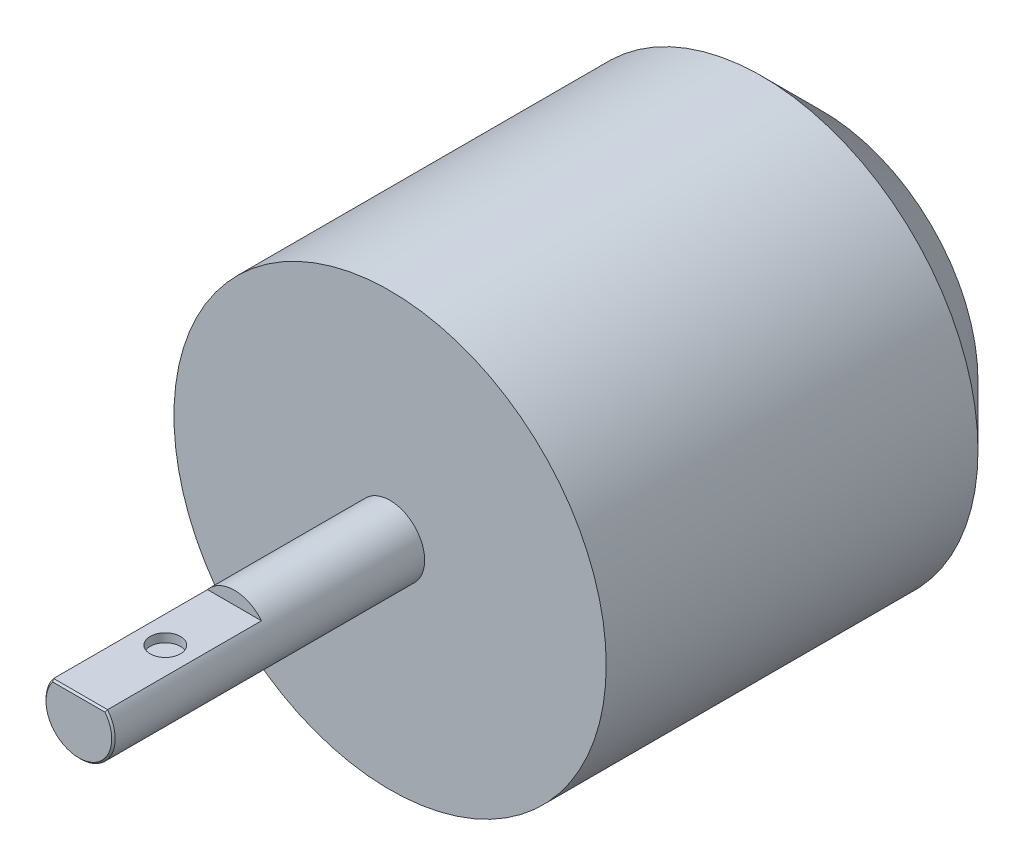
ISO-10303-21;
HEADER;
FILE_DESCRIPTION(('STEP AP214'),'2;1');
FILE_NAME('part.step','',(''),(''),'','','');
FILE_SCHEMA(('AUTOMOTIVE_DESIGN { 1 0 10303 214 1 1 1 1 }'));
ENDSEC;
DATA;
#1=APPLICATION_CONTEXT('core data for automotive mechanical design processes');
#2=APPLICATION_PROTOCOL_DEFINITION('international standard','automotive_design',2000,#1);
#3=PRODUCT_CONTEXT('',#1,'mechanical');
#4=PRODUCT('Part','Part','',(#3));
#5=PRODUCT_RELATED_PRODUCT_CATEGORY('part','',(#4));
#6=PRODUCT_DEFINITION_FORMATION('','',#4);
#7=PRODUCT_DEFINITION_CONTEXT('part definition',#1,'design');
#8=PRODUCT_DEFINITION('design','',#6,#7);
#9=PRODUCT_DEFINITION_SHAPE('','',#8);
#10=(LENGTH_UNIT() NAMED_UNIT(*) SI_UNIT(.MILLI.,.METRE.));
#11=(NAMED_UNIT(*) PLANE_ANGLE_UNIT() SI_UNIT($,.RADIAN.));
#12=(NAMED_UNIT(*) SI_UNIT($,.STERADIAN.) SOLID_ANGLE_UNIT());
#13=UNCERTAINTY_MEASURE_WITH_UNIT(LENGTH_MEASURE(1.E-05),#10,'distance_accuracy_value','');
#14=(GEOMETRIC_REPRESENTATION_CONTEXT(3) GLOBAL_UNCERTAINTY_ASSIGNED_CONTEXT((#13)) GLOBAL_UNIT_ASSIGNED_CONTEXT((#10,
#11,#12)) REPRESENTATION_CONTEXT('',''));
#15=CARTESIAN_POINT('',(0.,0.,0.));
#16=DIRECTION('',(0.,0.,1.));
#17=DIRECTION('',(1.,0.,0.));
#18=AXIS2_PLACEMENT_3D('',#15,#16,#17);
#19=CARTESIAN_POINT('',(0.,0.,50.));
#20=DIRECTION('',(0.,0.,-1.));
#21=DIRECTION('',(-1.,0.,0.));
#22=AXIS2_PLACEMENT_3D('',#19,#20,#21);
#23=CYLINDRICAL_SURFACE('',#22,25.);
#24=CARTESIAN_POINT('',(0.,0.,7.));
#25=DIRECTION('',(0.,0.,1.));
#26=DIRECTION('',(1.,0.,0.));
#27=AXIS2_PLACEMENT_3D('',#24,#25,#26);
#28=CIRCLE('',#27,25.);
#29=CARTESIAN_POINT('',(25.,0.,7.));
#30=VERTEX_POINT('',#29);
#31=EDGE_CURVE('E123',#30,#30,#28,.T.);
#32=ORIENTED_EDGE('',*,*,#31,.T.);
#33=EDGE_LOOP('',(#32));
#34=FACE_BOUND('',#33,.T.);
#35=CARTESIAN_POINT('',(0.,0.,50.));
#36=DIRECTION('',(0.,0.,1.));
#37=DIRECTION('',(1.,0.,0.));
#38=AXIS2_PLACEMENT_3D('',#35,#36,#37);
#39=CIRCLE('',#38,25.);
#40=CARTESIAN_POINT('',(25.,0.,50.));
#41=VERTEX_POINT('',#40);
#42=EDGE_CURVE('E117',#41,#41,#39,.T.);
#43=ORIENTED_EDGE('',*,*,#42,.F.);
#44=EDGE_LOOP('',(#43));
#45=FACE_BOUND('',#44,.T.);
#46=ADVANCED_FACE('F46',(#34,#45),#23,.T.);
#47=CARTESIAN_POINT('',(0.,0.,50.));
#48=DIRECTION('',(0.,0.,1.));
#49=DIRECTION('',(1.,0.,0.));
#50=AXIS2_PLACEMENT_3D('',#47,#48,#49);
#51=PLANE('',#50);
#52=CARTESIAN_POINT('',(0.,0.,50.));
#53=DIRECTION('',(0.,0.,1.));
#54=DIRECTION('',(1.,0.,0.));
#55=AXIS2_PLACEMENT_3D('',#52,#53,#54);
#56=CIRCLE('',#55,4.);
#57=CARTESIAN_POINT('',(4.,0.,50.));
#58=VERTEX_POINT('',#57);
#59=EDGE_CURVE('E110',#58,#58,#56,.T.);
#60=ORIENTED_EDGE('',*,*,#59,.F.);
#61=EDGE_LOOP('',(#60));
#62=FACE_BOUND('',#61,.T.);
#63=ORIENTED_EDGE('',*,*,#42,.T.);
#64=EDGE_LOOP('',(#63));
#65=FACE_BOUND('',#64,.T.);
#66=ADVANCED_FACE('F150',(#62,#65),#51,.T.);
#67=CARTESIAN_POINT('',(0.,0.,0.));
#68=DIRECTION('',(0.,0.,1.));
#69=DIRECTION('',(1.,0.,0.));
#70=AXIS2_PLACEMENT_3D('',#67,#68,#69);
#71=PLANE('',#70);
#72=CARTESIAN_POINT('',(0.,0.,0.));
#73=DIRECTION('',(0.,0.,-1.));
#74=DIRECTION('',(-1.,0.,0.));
#75=AXIS2_PLACEMENT_3D('',#72,#73,#74);
#76=CIRCLE('',#75,10.);
#77=CARTESIAN_POINT('',(-10.,0.,0.));
#78=VERTEX_POINT('',#77);
#79=EDGE_CURVE('E114',#78,#78,#76,.T.);
#80=ORIENTED_EDGE('',*,*,#79,.F.);
#81=EDGE_LOOP('',(#80));
#82=FACE_BOUND('',#81,.T.);
#83=CARTESIAN_POINT('',(0.,0.,0.));
#84=DIRECTION('',(0.,0.,1.));
#85=DIRECTION('',(1.,0.,0.));
#86=AXIS2_PLACEMENT_3D('',#83,#84,#85);
#87=CIRCLE('',#86,18.);
#88=CARTESIAN_POINT('',(18.,0.,0.));
#89=VERTEX_POINT('',#88);
#90=EDGE_CURVE('E120',#89,#89,#87,.F.);
#91=ORIENTED_EDGE('',*,*,#90,.T.);
#92=EDGE_LOOP('',(#91));
#93=FACE_BOUND('',#92,.T.);
#94=ADVANCED_FACE('F146',(#82,#93),#71,.F.);
#95=CARTESIAN_POINT('',(0.,0.,7.));
#96=DIRECTION('',(0.,0.,1.));
#97=DIRECTION('',(1.,0.,0.));
#98=AXIS2_PLACEMENT_3D('',#95,#96,#97);
#99=CONICAL_SURFACE('',#98,25.,0.78539816339745);
#100=CARTESIAN_POINT('',(18.,0.,0.));
#101=CARTESIAN_POINT('',(18.0729166666666,0.,0.0729166666666659));
#102=CARTESIAN_POINT('',(18.1458333333333,0.,0.145833333333333));
#103=CARTESIAN_POINT('',(18.2916666666666,0.,0.291666666666666));
#104=CARTESIAN_POINT('',(18.3645833333333,0.,0.364583333333333));
#105=CARTESIAN_POINT('',(18.5104166666666,0.,0.510416666666666));
#106=CARTESIAN_POINT('',(18.5833333333333,0.,0.583333333333333));
#107=CARTESIAN_POINT('',(18.7291666666666,0.,0.729166666666666));
#108=CARTESIAN_POINT('',(18.8020833333333,0.,0.802083333333332));
#109=CARTESIAN_POINT('',(18.9479166666666,0.,0.947916666666666));
#110=CARTESIAN_POINT('',(19.0208333333333,0.,1.02083333333333));
#111=CARTESIAN_POINT('',(19.1666666666666,0.,1.16666666666667));
#112=CARTESIAN_POINT('',(19.2395833333333,0.,1.23958333333333));
#113=CARTESIAN_POINT('',(19.3854166666666,0.,1.38541666666667));
#114=CARTESIAN_POINT('',(19.4583333333333,0.,1.45833333333333));
#115=CARTESIAN_POINT('',(19.6041666666666,0.,1.60416666666667));
#116=CARTESIAN_POINT('',(19.6770833333333,0.,1.67708333333333));
#117=CARTESIAN_POINT('',(19.8229166666667,0.,1.82291666666667));
#118=CARTESIAN_POINT('',(19.8958333333333,0.,1.89583333333333));
#119=CARTESIAN_POINT('',(20.0416666666667,0.,2.04166666666667));
#120=CARTESIAN_POINT('',(20.1145833333333,0.,2.11458333333333));
#121=CARTESIAN_POINT('',(20.2604166666667,0.,2.26041666666667));
#122=CARTESIAN_POINT('',(20.3333333333333,0.,2.33333333333333));
#123=CARTESIAN_POINT('',(20.4791666666667,0.,2.47916666666667));
#124=CARTESIAN_POINT('',(20.5520833333333,0.,2.55208333333333));
#125=CARTESIAN_POINT('',(20.6979166666667,0.,2.69791666666667));
#126=CARTESIAN_POINT('',(20.7708333333333,0.,2.77083333333333));
#127=CARTESIAN_POINT('',(20.9166666666667,0.,2.91666666666667));
#128=CARTESIAN_POINT('',(20.9895833333333,0.,2.98958333333333));
#129=CARTESIAN_POINT('',(21.1354166666667,0.,3.13541666666667));
#130=CARTESIAN_POINT('',(21.2083333333333,0.,3.20833333333333));
#131=CARTESIAN_POINT('',(21.3541666666667,0.,3.35416666666667));
#132=CARTESIAN_POINT('',(21.4270833333333,0.,3.42708333333333));
#133=CARTESIAN_POINT('',(21.5729166666667,0.,3.57291666666667));
#134=CARTESIAN_POINT('',(21.6458333333333,0.,3.64583333333333));
#135=CARTESIAN_POINT('',(21.7916666666667,0.,3.79166666666667));
#136=CARTESIAN_POINT('',(21.8645833333333,0.,3.86458333333333));
#137=CARTESIAN_POINT('',(22.0104166666667,0.,4.01041666666667));
#138=CARTESIAN_POINT('',(22.0833333333333,0.,4.08333333333333));
#139=CARTESIAN_POINT('',(22.2291666666667,0.,4.22916666666667));
#140=CARTESIAN_POINT('',(22.3020833333333,0.,4.30208333333333));
#141=CARTESIAN_POINT('',(22.4479166666667,0.,4.44791666666667));
#142=CARTESIAN_POINT('',(22.5208333333333,0.,4.52083333333333));
#143=CARTESIAN_POINT('',(22.6666666666667,0.,4.66666666666667));
#144=CARTESIAN_POINT('',(22.7395833333333,0.,4.73958333333333));
#145=CARTESIAN_POINT('',(22.8854166666667,0.,4.88541666666667));
#146=CARTESIAN_POINT('',(22.9583333333333,0.,4.95833333333333));
#147=CARTESIAN_POINT('',(23.1041666666667,0.,5.10416666666667));
#148=CARTESIAN_POINT('',(23.1770833333333,0.,5.17708333333333));
#149=CARTESIAN_POINT('',(23.3229166666667,0.,5.32291666666667));
#150=CARTESIAN_POINT('',(23.3958333333333,0.,5.39583333333333));
#151=CARTESIAN_POINT('',(23.5416666666667,0.,5.54166666666667));
#152=CARTESIAN_POINT('',(23.6145833333333,0.,5.61458333333333));
#153=CARTESIAN_POINT('',(23.7604166666667,0.,5.76041666666667));
#154=CARTESIAN_POINT('',(23.8333333333333,0.,5.83333333333333));
#155=CARTESIAN_POINT('',(23.9791666666667,0.,5.97916666666667));
#156=CARTESIAN_POINT('',(24.0520833333333,0.,6.05208333333333));
#157=CARTESIAN_POINT('',(24.1979166666667,0.,6.19791666666667));
#158=CARTESIAN_POINT('',(24.2708333333333,0.,6.27083333333333));
#159=CARTESIAN_POINT('',(24.4166666666667,0.,6.41666666666667));
#160=CARTESIAN_POINT('',(24.4895833333333,0.,6.48958333333333));
#161=CARTESIAN_POINT('',(24.6354166666667,0.,6.63541666666667));
#162=CARTESIAN_POINT('',(24.7083333333333,0.,6.70833333333333));
#163=CARTESIAN_POINT('',(24.8541666666667,0.,6.85416666666667));
#164=CARTESIAN_POINT('',(24.9270833333333,0.,6.92708333333333));
#165=CARTESIAN_POINT('',(25.,0.,7.));
#166=B_SPLINE_CURVE_WITH_KNOTS('',3,(#100,#101,#102,#103,#104,#105,#106,#107,#108,#109,#110,
#111,#112,#113,#114,#115,#116,#117,#118,#119,#120,#121,#122,#123,#124,#125,#126,#127,#128,#129,
#130,#131,#132,#133,#134,#135,#136,#137,#138,#139,#140,#141,#142,#143,#144,#145,#146,#147,#148,
#149,#150,#151,#152,#153,#154,#155,#156,#157,#158,#159,#160,#161,#162,#163,#164,#165),
.UNSPECIFIED.,.F.,.F.,(4,2,2,2,2,2,2,2,2,2,2,2,2,2,2,2,2,2,2,2,2,2,2,2,2,2,2,2,2,2,2,2,4),(0.,
0.309359216769115,0.61871843353823,0.928077650307344,1.23743686707646,1.54679608384557,
1.85615530061469,2.16551451738381,2.47487373415292,2.78423295092203,3.09359216769115,
3.40295138446026,3.71231060122938,4.0216698179985,4.33102903476761,4.64038825153672,
4.94974746830584,5.25910668507495,5.56846590184407,5.87782511861318,6.1871843353823,
6.49654355215141,6.80590276892053,7.11526198568965,7.42462120245876,7.73398041922788,
8.04333963599699,8.35269885276611,8.66205806953522,8.97141728630434,9.28077650307345,
9.59013571984257,9.89949493661168),.UNSPECIFIED.);
#167=EDGE_CURVE('BSEAM141',#89,#30,#166,.T.);
#168=ORIENTED_EDGE('',*,*,#90,.F.);
#169=ORIENTED_EDGE('',*,*,#31,.F.);
#170=ORIENTED_EDGE('',*,*,#167,.T.);
#171=ORIENTED_EDGE('',*,*,#167,.F.);
#172=EDGE_LOOP('',(#168,#170,#169,#171));
#173=FACE_BOUND('',#172,.T.);
#174=ADVANCED_FACE('F141',(#173),#99,.T.);
#175=CARTESIAN_POINT('',(0.,0.,-1.5));
#176=DIRECTION('',(0.,0.,1.));
#177=DIRECTION('',(1.,0.,0.));
#178=AXIS2_PLACEMENT_3D('',#175,#176,#177);
#179=CYLINDRICAL_SURFACE('',#178,10.);
#180=CARTESIAN_POINT('',(0.,0.,-1.5));
#181=DIRECTION('',(0.,0.,-1.));
#182=DIRECTION('',(-1.,0.,0.));
#183=AXIS2_PLACEMENT_3D('',#180,#181,#182);
#184=CIRCLE('',#183,10.);
#185=CARTESIAN_POINT('',(-10.,0.,-1.5));
#186=VERTEX_POINT('',#185);
#187=EDGE_CURVE('E107',#186,#186,#184,.T.);
#188=ORIENTED_EDGE('',*,*,#187,.F.);
#189=EDGE_LOOP('',(#188));
#190=FACE_BOUND('',#189,.T.);
#191=ORIENTED_EDGE('',*,*,#79,.T.);
#192=EDGE_LOOP('',(#191));
#193=FACE_BOUND('',#192,.T.);
#194=ADVANCED_FACE('F145',(#190,#193),#179,.T.);
#195=CARTESIAN_POINT('',(0.,0.,-1.5));
#196=DIRECTION('',(0.,0.,-1.));
#197=DIRECTION('',(-1.,0.,0.));
#198=AXIS2_PLACEMENT_3D('',#195,#196,#197);
#199=PLANE('',#198);
#200=ORIENTED_EDGE('',*,*,#187,.T.);
#201=EDGE_LOOP('',(#200));
#202=FACE_BOUND('',#201,.T.);
#203=ADVANCED_FACE('F160',(#202),#199,.T.);
#204=CARTESIAN_POINT('',(0.,0.,86.));
#205=DIRECTION('',(0.,0.,-1.));
#206=DIRECTION('',(-1.,0.,0.));
#207=AXIS2_PLACEMENT_3D('',#204,#205,#206);
#208=CYLINDRICAL_SURFACE('',#207,4.);
#209=DIRECTION('',(0.,0.,1.));
#210=VECTOR('',#209,1.);
#211=CARTESIAN_POINT('',(3.1224989991992,2.5,68.));
#212=LINE('',#211,#210);
#213=CARTESIAN_POINT('',(3.1224989991992,2.5,68.));
#214=VERTEX_POINT('',#213);
#215=CARTESIAN_POINT('',(3.1224989991992,2.5,85.8));
#216=VERTEX_POINT('',#215);
#217=EDGE_CURVE('E101',#214,#216,#212,.T.);
#218=ORIENTED_EDGE('',*,*,#217,.T.);
#219=CARTESIAN_POINT('',(0.,0.,85.8));
#220=DIRECTION('',(0.,0.,1.));
#221=DIRECTION('',(1.,0.,0.));
#222=AXIS2_PLACEMENT_3D('',#219,#220,#221);
#223=CIRCLE('',#222,4.);
#224=CARTESIAN_POINT('',(-3.1224989991992,2.5,85.8));
#225=VERTEX_POINT('',#224);
#226=EDGE_CURVE('E13',#216,#225,#223,.F.);
#227=ORIENTED_EDGE('',*,*,#226,.T.);
#228=DIRECTION('',(0.,0.,1.));
#229=VECTOR('',#228,1.);
#230=CARTESIAN_POINT('',(-3.1224989991992,2.5,68.));
#231=LINE('',#230,#229);
#232=CARTESIAN_POINT('',(-3.1224989991992,2.5,68.));
#233=VERTEX_POINT('',#232);
#234=EDGE_CURVE('E100',#233,#225,#231,.T.);
#235=ORIENTED_EDGE('',*,*,#234,.F.);
#236=CARTESIAN_POINT('',(0.,0.,68.));
#237=DIRECTION('',(0.,0.,1.));
#238=DIRECTION('',(1.,0.,0.));
#239=AXIS2_PLACEMENT_3D('',#236,#237,#238);
#240=CIRCLE('',#239,4.);
#241=EDGE_CURVE('E87',#214,#233,#240,.T.);
#242=ORIENTED_EDGE('',*,*,#241,.F.);
#243=EDGE_LOOP('',(#218,#227,#235,#242));
#244=FACE_BOUND('',#243,.T.);
#245=ORIENTED_EDGE('',*,*,#59,.T.);
#246=EDGE_LOOP('',(#245));
#247=FACE_BOUND('',#246,.T.);
#248=ADVANCED_FACE('F103',(#244,#247),#208,.T.);
#249=CARTESIAN_POINT('',(0.,0.,86.));
#250=DIRECTION('',(0.,0.,1.));
#251=DIRECTION('',(1.,0.,0.));
#252=AXIS2_PLACEMENT_3D('',#249,#250,#251);
#253=PLANE('',#252);
#254=CARTESIAN_POINT('',(0.,0.,86.));
#255=DIRECTION('',(0.,0.,1.));
#256=DIRECTION('',(1.,0.,0.));
#257=AXIS2_PLACEMENT_3D('',#254,#255,#256);
#258=CIRCLE('',#257,3.80000000000001);
#259=CARTESIAN_POINT('',(-3.02489669245084,2.30000000000001,86.));
#260=VERTEX_POINT('',#259);
#261=CARTESIAN_POINT('',(3.02489669245084,2.30000000000001,86.));
#262=VERTEX_POINT('',#261);
#263=EDGE_CURVE('E67',#260,#262,#258,.T.);
#264=ORIENTED_EDGE('',*,*,#263,.T.);
#265=DIRECTION('',(-1.,0.,0.));
#266=VECTOR('',#265,1.);
#267=CARTESIAN_POINT('',(-3.1224989991992,2.30000000000001,86.));
#268=LINE('',#267,#266);
#269=EDGE_CURVE('E60',#262,#260,#268,.T.);
#270=ORIENTED_EDGE('',*,*,#269,.T.);
#271=EDGE_LOOP('',(#264,#270));
#272=FACE_BOUND('',#271,.T.);
#273=ADVANCED_FACE('F167',(#272),#253,.T.);
#274=CARTESIAN_POINT('',(0.,2.5,68.));
#275=DIRECTION('',(0.,-1.,0.));
#276=DIRECTION('',(0.,0.,-1.));
#277=AXIS2_PLACEMENT_3D('',#274,#275,#276);
#278=PLANE('',#277);
#279=CARTESIAN_POINT('',(0.,2.5,76.));
#280=DIRECTION('',(0.,1.,0.));
#281=DIRECTION('',(0.,0.,1.));
#282=AXIS2_PLACEMENT_3D('',#279,#280,#281);
#283=CIRCLE('',#282,1.75);
#284=CARTESIAN_POINT('',(0.,2.5,77.75));
#285=VERTEX_POINT('',#284);
#286=EDGE_CURVE('E185',#285,#285,#283,.T.);
#287=ORIENTED_EDGE('',*,*,#286,.F.);
#288=EDGE_LOOP('',(#287));
#289=FACE_BOUND('',#288,.T.);
#290=ORIENTED_EDGE('',*,*,#234,.T.);
#291=DIRECTION('',(1.,0.,0.));
#292=VECTOR('',#291,1.);
#293=CARTESIAN_POINT('',(3.1224989991992,2.5,85.8));
#294=LINE('',#293,#292);
#295=EDGE_CURVE('E113',#225,#216,#294,.T.);
#296=ORIENTED_EDGE('',*,*,#295,.T.);
#297=ORIENTED_EDGE('',*,*,#217,.F.);
#298=DIRECTION('',(1.,0.,0.));
#299=VECTOR('',#298,1.);
#300=CARTESIAN_POINT('',(0.,2.5,68.));
#301=LINE('',#300,#299);
#302=EDGE_CURVE('E90',#233,#214,#301,.T.);
#303=ORIENTED_EDGE('',*,*,#302,.F.);
#304=EDGE_LOOP('',(#290,#296,#297,#303));
#305=FACE_BOUND('',#304,.T.);
#306=ADVANCED_FACE('F98',(#289,#305),#278,.F.);
#307=CARTESIAN_POINT('',(0.,0.,68.));
#308=DIRECTION('',(0.,0.,1.));
#309=DIRECTION('',(1.,0.,0.));
#310=AXIS2_PLACEMENT_3D('',#307,#308,#309);
#311=PLANE('',#310);
#312=ORIENTED_EDGE('',*,*,#241,.T.);
#313=ORIENTED_EDGE('',*,*,#302,.T.);
#314=EDGE_LOOP('',(#312,#313));
#315=FACE_BOUND('',#314,.T.);
#316=ADVANCED_FACE('F89',(#315),#311,.T.);
#317=CARTESIAN_POINT('',(0.,1.5,76.));
#318=DIRECTION('',(0.,1.,0.));
#319=DIRECTION('',(0.,0.,1.));
#320=AXIS2_PLACEMENT_3D('',#317,#318,#319);
#321=CYLINDRICAL_SURFACE('',#320,1.75);
#322=CARTESIAN_POINT('',(0.,1.5,76.));
#323=DIRECTION('',(0.,1.,0.));
#324=DIRECTION('',(0.,0.,1.));
#325=AXIS2_PLACEMENT_3D('',#322,#323,#324);
#326=CIRCLE('',#325,1.75);
#327=CARTESIAN_POINT('',(0.,1.5,77.75));
#328=VERTEX_POINT('',#327);
#329=EDGE_CURVE('E94',#328,#328,#326,.T.);
#330=ORIENTED_EDGE('',*,*,#329,.F.);
#331=EDGE_LOOP('',(#330));
#332=FACE_BOUND('',#331,.T.);
#333=ORIENTED_EDGE('',*,*,#286,.T.);
#334=EDGE_LOOP('',(#333));
#335=FACE_BOUND('',#334,.T.);
#336=ADVANCED_FACE('F175',(#332,#335),#321,.F.);
#337=CARTESIAN_POINT('',(0.,1.5,76.));
#338=DIRECTION('',(0.,1.,0.));
#339=DIRECTION('',(0.,0.,1.));
#340=AXIS2_PLACEMENT_3D('',#337,#338,#339);
#341=PLANE('',#340);
#342=ORIENTED_EDGE('',*,*,#329,.T.);
#343=EDGE_LOOP('',(#342));
#344=FACE_BOUND('',#343,.T.);
#345=ADVANCED_FACE('F139',(#344),#341,.T.);
#346=CARTESIAN_POINT('',(0.,0.,86.));
#347=DIRECTION('',(0.,0.,-1.));
#348=DIRECTION('',(-1.,0.,0.));
#349=AXIS2_PLACEMENT_3D('',#346,#347,#348);
#350=CONICAL_SURFACE('',#349,3.80000000000001,0.78539816339744);
#351=CARTESIAN_POINT('',(3.1224989991992,2.5,85.8));
#352=CARTESIAN_POINT('',(3.10646272921448,2.46661036046921,85.8333896395308));
#353=CARTESIAN_POINT('',(3.0903110699272,2.43324887659365,85.8667511234063));
#354=CARTESIAN_POINT('',(3.05777696774867,2.36658220990968,85.9334177900903));
#355=CARTESIAN_POINT('',(3.04139452478649,2.33327702711858,85.9667229728814));
#356=CARTESIAN_POINT('',(3.02489669245084,2.30000000000001,86.));
#357=B_SPLINE_CURVE_WITH_KNOTS('',3,(#351,#352,#353,#354,#355,#356),.UNSPECIFIED.,.F.,.F.,(4,2,
4),(0.,0.149605079440566,0.299210204854634),.UNSPECIFIED.);
#358=EDGE_CURVE('E130',#262,#216,#357,.F.);
#359=ORIENTED_EDGE('',*,*,#358,.F.);
#360=ORIENTED_EDGE('',*,*,#263,.F.);
#361=CARTESIAN_POINT('',(-3.02489669245084,2.30000000000001,86.));
#362=CARTESIAN_POINT('',(-3.0413945247865,2.33327702711858,85.9667229728814));
#363=CARTESIAN_POINT('',(-3.05777696774867,2.36658220990969,85.9334177900903));
#364=CARTESIAN_POINT('',(-3.0903110699272,2.43324887659366,85.8667511234063));
#365=CARTESIAN_POINT('',(-3.10646272921449,2.46661036046922,85.8333896395308));
#366=CARTESIAN_POINT('',(-3.1224989991992,2.5,85.8));
#367=B_SPLINE_CURVE_WITH_KNOTS('',3,(#361,#362,#363,#364,#365,#366),.UNSPECIFIED.,.F.,.F.,(4,2,
4),(0.,0.149605125414066,0.299210204854633),.UNSPECIFIED.);
#368=EDGE_CURVE('E51',#225,#260,#367,.F.);
#369=ORIENTED_EDGE('',*,*,#368,.F.);
#370=ORIENTED_EDGE('',*,*,#226,.F.);
#371=EDGE_LOOP('',(#359,#360,#369,#370));
#372=FACE_BOUND('',#371,.T.);
#373=ADVANCED_FACE('F135',(#372),#350,.T.);
#374=CARTESIAN_POINT('',(0.,2.5,85.8));
#375=DIRECTION('',(0.,0.707106781186554,0.707106781186541));
#376=DIRECTION('',(-1.,0.,0.));
#377=AXIS2_PLACEMENT_3D('',#374,#375,#376);
#378=PLANE('',#377);
#379=ORIENTED_EDGE('',*,*,#368,.T.);
#380=ORIENTED_EDGE('',*,*,#269,.F.);
#381=ORIENTED_EDGE('',*,*,#358,.T.);
#382=ORIENTED_EDGE('',*,*,#295,.F.);
#383=EDGE_LOOP('',(#379,#380,#381,#382));
#384=FACE_BOUND('',#383,.T.);
#385=ADVANCED_FACE('F48',(#384),#378,.T.);
#386=CLOSED_SHELL('',(#46,#66,#94,#174,#194,#203,#248,#273,#306,#316,#336,#345,#373,#385));
#387=MANIFOLD_SOLID_BREP('B2',#386);
#388=ADVANCED_BREP_SHAPE_REPRESENTATION('',(#18,#387),#14);
#389=SHAPE_DEFINITION_REPRESENTATION(#9,#388);
ENDSEC;
END-ISO-10303-21;
